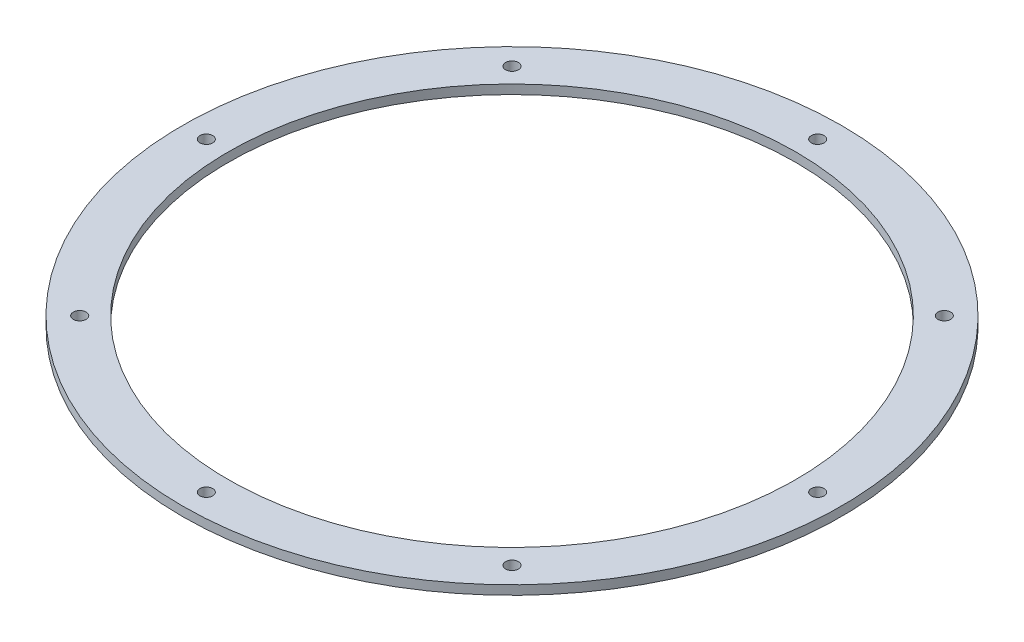
ISO-10303-21;
HEADER;
FILE_DESCRIPTION(('STEP AP214'),'2;1');
FILE_NAME('part.step','',(''),(''),'','','');
FILE_SCHEMA(('AUTOMOTIVE_DESIGN { 1 0 10303 214 1 1 1 1 }'));
ENDSEC;
DATA;
#1=APPLICATION_CONTEXT('core data for automotive mechanical design processes');
#2=APPLICATION_PROTOCOL_DEFINITION('international standard','automotive_design',2000,#1);
#3=PRODUCT_CONTEXT('',#1,'mechanical');
#4=PRODUCT('Part','Part','',(#3));
#5=PRODUCT_RELATED_PRODUCT_CATEGORY('part','',(#4));
#6=PRODUCT_DEFINITION_FORMATION('','',#4);
#7=PRODUCT_DEFINITION_CONTEXT('part definition',#1,'design');
#8=PRODUCT_DEFINITION('design','',#6,#7);
#9=PRODUCT_DEFINITION_SHAPE('','',#8);
#10=(LENGTH_UNIT() NAMED_UNIT(*) SI_UNIT(.MILLI.,.METRE.));
#11=(NAMED_UNIT(*) PLANE_ANGLE_UNIT() SI_UNIT($,.RADIAN.));
#12=(NAMED_UNIT(*) SI_UNIT($,.STERADIAN.) SOLID_ANGLE_UNIT());
#13=UNCERTAINTY_MEASURE_WITH_UNIT(LENGTH_MEASURE(1.E-05),#10,'distance_accuracy_value','');
#14=(GEOMETRIC_REPRESENTATION_CONTEXT(3) GLOBAL_UNCERTAINTY_ASSIGNED_CONTEXT((#13)) GLOBAL_UNIT_ASSIGNED_CONTEXT((#10,
#11,#12)) REPRESENTATION_CONTEXT('',''));
#15=CARTESIAN_POINT('',(0.,0.,0.));
#16=DIRECTION('',(0.,0.,1.));
#17=DIRECTION('',(1.,0.,0.));
#18=AXIS2_PLACEMENT_3D('',#15,#16,#17);
#19=CARTESIAN_POINT('',(0.,0.,0.));
#20=DIRECTION('',(0.,-1.,0.));
#21=DIRECTION('',(0.,0.,-1.));
#22=AXIS2_PLACEMENT_3D('',#19,#20,#21);
#23=CYLINDRICAL_SURFACE('',#22,93.08);
#24=CARTESIAN_POINT('',(0.,0.,0.));
#25=DIRECTION('',(0.,-1.,0.));
#26=DIRECTION('',(0.,0.,-1.));
#27=AXIS2_PLACEMENT_3D('',#24,#25,#26);
#28=CIRCLE('',#27,93.08);
#29=CARTESIAN_POINT('',(0.,0.,-93.08));
#30=VERTEX_POINT('',#29);
#31=EDGE_CURVE('E78',#30,#30,#28,.T.);
#32=ORIENTED_EDGE('',*,*,#31,.T.);
#33=EDGE_LOOP('',(#32));
#34=FACE_BOUND('',#33,.T.);
#35=CARTESIAN_POINT('',(0.,3.,0.));
#36=DIRECTION('',(0.,-1.,0.));
#37=DIRECTION('',(0.,0.,-1.));
#38=AXIS2_PLACEMENT_3D('',#35,#36,#37);
#39=CIRCLE('',#38,93.08);
#40=CARTESIAN_POINT('',(0.,3.,-93.08));
#41=VERTEX_POINT('',#40);
#42=EDGE_CURVE('E10',#41,#41,#39,.T.);
#43=ORIENTED_EDGE('',*,*,#42,.F.);
#44=EDGE_LOOP('',(#43));
#45=FACE_BOUND('',#44,.T.);
#46=ADVANCED_FACE('F39',(#34,#45),#23,.F.);
#47=CARTESIAN_POINT('',(93.08,3.,0.));
#48=DIRECTION('',(0.,1.,0.));
#49=DIRECTION('',(0.,0.,1.));
#50=AXIS2_PLACEMENT_3D('',#47,#48,#49);
#51=PLANE('',#50);
#52=CARTESIAN_POINT('',(-100.25,3.,0.));
#53=DIRECTION('',(0.,1.,0.));
#54=DIRECTION('',(0.,0.,1.));
#55=AXIS2_PLACEMENT_3D('',#52,#53,#54);
#56=CIRCLE('',#55,2.1);
#57=CARTESIAN_POINT('',(-100.25,3.,2.1));
#58=VERTEX_POINT('',#57);
#59=EDGE_CURVE('E59',#58,#58,#56,.T.);
#60=ORIENTED_EDGE('',*,*,#59,.F.);
#61=EDGE_LOOP('',(#60));
#62=FACE_BOUND('',#61,.T.);
#63=CARTESIAN_POINT('',(-70.8874548139514,3.,-70.8874548139514));
#64=DIRECTION('',(0.,1.,0.));
#65=DIRECTION('',(0.,0.,1.));
#66=AXIS2_PLACEMENT_3D('',#63,#64,#65);
#67=CIRCLE('',#66,2.1);
#68=CARTESIAN_POINT('',(-70.8874548139514,3.,-68.7874548139514));
#69=VERTEX_POINT('',#68);
#70=EDGE_CURVE('E105',#69,#69,#67,.T.);
#71=ORIENTED_EDGE('',*,*,#70,.F.);
#72=EDGE_LOOP('',(#71));
#73=FACE_BOUND('',#72,.T.);
#74=CARTESIAN_POINT('',(0.,3.,-100.25));
#75=DIRECTION('',(0.,1.,0.));
#76=DIRECTION('',(0.,0.,1.));
#77=AXIS2_PLACEMENT_3D('',#74,#75,#76);
#78=CIRCLE('',#77,2.1);
#79=CARTESIAN_POINT('',(0.,3.,-98.15));
#80=VERTEX_POINT('',#79);
#81=EDGE_CURVE('E102',#80,#80,#78,.T.);
#82=ORIENTED_EDGE('',*,*,#81,.F.);
#83=EDGE_LOOP('',(#82));
#84=FACE_BOUND('',#83,.T.);
#85=CARTESIAN_POINT('',(70.8874548139514,3.,-70.8874548139514));
#86=DIRECTION('',(0.,1.,0.));
#87=DIRECTION('',(0.,0.,1.));
#88=AXIS2_PLACEMENT_3D('',#85,#86,#87);
#89=CIRCLE('',#88,2.1);
#90=CARTESIAN_POINT('',(70.8874548139514,3.,-68.7874548139514));
#91=VERTEX_POINT('',#90);
#92=EDGE_CURVE('E99',#91,#91,#89,.T.);
#93=ORIENTED_EDGE('',*,*,#92,.F.);
#94=EDGE_LOOP('',(#93));
#95=FACE_BOUND('',#94,.T.);
#96=CARTESIAN_POINT('',(100.25,3.,0.));
#97=DIRECTION('',(0.,1.,0.));
#98=DIRECTION('',(0.,0.,1.));
#99=AXIS2_PLACEMENT_3D('',#96,#97,#98);
#100=CIRCLE('',#99,2.1);
#101=CARTESIAN_POINT('',(100.25,3.,2.09999999999999));
#102=VERTEX_POINT('',#101);
#103=EDGE_CURVE('E96',#102,#102,#100,.T.);
#104=ORIENTED_EDGE('',*,*,#103,.F.);
#105=EDGE_LOOP('',(#104));
#106=FACE_BOUND('',#105,.T.);
#107=CARTESIAN_POINT('',(70.8874548139514,3.,70.8874548139514));
#108=DIRECTION('',(0.,1.,0.));
#109=DIRECTION('',(0.,0.,1.));
#110=AXIS2_PLACEMENT_3D('',#107,#108,#109);
#111=CIRCLE('',#110,2.1);
#112=CARTESIAN_POINT('',(70.8874548139514,3.,72.9874548139514));
#113=VERTEX_POINT('',#112);
#114=EDGE_CURVE('E93',#113,#113,#111,.T.);
#115=ORIENTED_EDGE('',*,*,#114,.F.);
#116=EDGE_LOOP('',(#115));
#117=FACE_BOUND('',#116,.T.);
#118=CARTESIAN_POINT('',(0.,3.,100.25));
#119=DIRECTION('',(0.,1.,0.));
#120=DIRECTION('',(0.,0.,1.));
#121=AXIS2_PLACEMENT_3D('',#118,#119,#120);
#122=CIRCLE('',#121,2.1);
#123=CARTESIAN_POINT('',(0.,3.,102.35));
#124=VERTEX_POINT('',#123);
#125=EDGE_CURVE('E90',#124,#124,#122,.T.);
#126=ORIENTED_EDGE('',*,*,#125,.F.);
#127=EDGE_LOOP('',(#126));
#128=FACE_BOUND('',#127,.T.);
#129=CARTESIAN_POINT('',(-70.8874548139514,3.,70.8874548139514));
#130=DIRECTION('',(0.,1.,0.));
#131=DIRECTION('',(0.,0.,1.));
#132=AXIS2_PLACEMENT_3D('',#129,#130,#131);
#133=CIRCLE('',#132,2.1);
#134=CARTESIAN_POINT('',(-70.8874548139514,3.,72.9874548139514));
#135=VERTEX_POINT('',#134);
#136=EDGE_CURVE('E87',#135,#135,#133,.T.);
#137=ORIENTED_EDGE('',*,*,#136,.F.);
#138=EDGE_LOOP('',(#137));
#139=FACE_BOUND('',#138,.T.);
#140=ORIENTED_EDGE('',*,*,#42,.T.);
#141=EDGE_LOOP('',(#140));
#142=FACE_BOUND('',#141,.T.);
#143=CARTESIAN_POINT('',(0.,3.,0.));
#144=DIRECTION('',(0.,-1.,0.));
#145=DIRECTION('',(0.,0.,-1.));
#146=AXIS2_PLACEMENT_3D('',#143,#144,#145);
#147=CIRCLE('',#146,108.08);
#148=CARTESIAN_POINT('',(0.,3.,-108.08));
#149=VERTEX_POINT('',#148);
#150=EDGE_CURVE('E46',#149,#149,#147,.T.);
#151=ORIENTED_EDGE('',*,*,#150,.F.);
#152=EDGE_LOOP('',(#151));
#153=FACE_BOUND('',#152,.T.);
#154=ADVANCED_FACE('F113',(#62,#73,#84,#95,#106,#117,#128,#139,#142,#153),#51,.T.);
#155=CARTESIAN_POINT('',(0.,0.,0.));
#156=DIRECTION('',(0.,-1.,0.));
#157=DIRECTION('',(0.,0.,-1.));
#158=AXIS2_PLACEMENT_3D('',#155,#156,#157);
#159=CYLINDRICAL_SURFACE('',#158,108.08);
#160=ORIENTED_EDGE('',*,*,#150,.T.);
#161=EDGE_LOOP('',(#160));
#162=FACE_BOUND('',#161,.T.);
#163=CARTESIAN_POINT('',(0.,0.,0.));
#164=DIRECTION('',(0.,-1.,0.));
#165=DIRECTION('',(0.,0.,-1.));
#166=AXIS2_PLACEMENT_3D('',#163,#164,#165);
#167=CIRCLE('',#166,108.08);
#168=CARTESIAN_POINT('',(0.,0.,-108.08));
#169=VERTEX_POINT('',#168);
#170=EDGE_CURVE('E51',#169,#169,#167,.T.);
#171=ORIENTED_EDGE('',*,*,#170,.F.);
#172=EDGE_LOOP('',(#171));
#173=FACE_BOUND('',#172,.T.);
#174=ADVANCED_FACE('F116',(#162,#173),#159,.T.);
#175=CARTESIAN_POINT('',(93.08,0.,0.));
#176=DIRECTION('',(0.,-1.,0.));
#177=DIRECTION('',(0.,0.,-1.));
#178=AXIS2_PLACEMENT_3D('',#175,#176,#177);
#179=PLANE('',#178);
#180=CARTESIAN_POINT('',(-100.25,0.,0.));
#181=DIRECTION('',(0.,-1.,0.));
#182=DIRECTION('',(0.,0.,-1.));
#183=AXIS2_PLACEMENT_3D('',#180,#181,#182);
#184=CIRCLE('',#183,2.1);
#185=CARTESIAN_POINT('',(-100.25,0.,-2.1));
#186=VERTEX_POINT('',#185);
#187=EDGE_CURVE('E42',#186,#186,#184,.T.);
#188=ORIENTED_EDGE('',*,*,#187,.F.);
#189=EDGE_LOOP('',(#188));
#190=FACE_BOUND('',#189,.T.);
#191=CARTESIAN_POINT('',(-70.8874548139514,0.,-70.8874548139514));
#192=DIRECTION('',(0.,-1.,0.));
#193=DIRECTION('',(0.,0.,-1.));
#194=AXIS2_PLACEMENT_3D('',#191,#192,#193);
#195=CIRCLE('',#194,2.1);
#196=CARTESIAN_POINT('',(-70.8874548139514,0.,-72.9874548139514));
#197=VERTEX_POINT('',#196);
#198=EDGE_CURVE('E73',#197,#197,#195,.T.);
#199=ORIENTED_EDGE('',*,*,#198,.F.);
#200=EDGE_LOOP('',(#199));
#201=FACE_BOUND('',#200,.T.);
#202=CARTESIAN_POINT('',(0.,0.,-100.25));
#203=DIRECTION('',(0.,-1.,0.));
#204=DIRECTION('',(0.,0.,-1.));
#205=AXIS2_PLACEMENT_3D('',#202,#203,#204);
#206=CIRCLE('',#205,2.1);
#207=CARTESIAN_POINT('',(0.,0.,-102.35));
#208=VERTEX_POINT('',#207);
#209=EDGE_CURVE('E71',#208,#208,#206,.T.);
#210=ORIENTED_EDGE('',*,*,#209,.F.);
#211=EDGE_LOOP('',(#210));
#212=FACE_BOUND('',#211,.T.);
#213=CARTESIAN_POINT('',(70.8874548139514,0.,-70.8874548139514));
#214=DIRECTION('',(0.,-1.,0.));
#215=DIRECTION('',(0.,0.,-1.));
#216=AXIS2_PLACEMENT_3D('',#213,#214,#215);
#217=CIRCLE('',#216,2.1);
#218=CARTESIAN_POINT('',(70.8874548139514,0.,-72.9874548139514));
#219=VERTEX_POINT('',#218);
#220=EDGE_CURVE('E68',#219,#219,#217,.T.);
#221=ORIENTED_EDGE('',*,*,#220,.F.);
#222=EDGE_LOOP('',(#221));
#223=FACE_BOUND('',#222,.T.);
#224=CARTESIAN_POINT('',(100.25,0.,0.));
#225=DIRECTION('',(0.,-1.,0.));
#226=DIRECTION('',(0.,0.,-1.));
#227=AXIS2_PLACEMENT_3D('',#224,#225,#226);
#228=CIRCLE('',#227,2.1);
#229=CARTESIAN_POINT('',(100.25,0.,-2.10000000000002));
#230=VERTEX_POINT('',#229);
#231=EDGE_CURVE('E65',#230,#230,#228,.T.);
#232=ORIENTED_EDGE('',*,*,#231,.F.);
#233=EDGE_LOOP('',(#232));
#234=FACE_BOUND('',#233,.T.);
#235=CARTESIAN_POINT('',(70.8874548139514,0.,70.8874548139514));
#236=DIRECTION('',(0.,-1.,0.));
#237=DIRECTION('',(0.,0.,-1.));
#238=AXIS2_PLACEMENT_3D('',#235,#236,#237);
#239=CIRCLE('',#238,2.1);
#240=CARTESIAN_POINT('',(70.8874548139514,0.,68.7874548139514));
#241=VERTEX_POINT('',#240);
#242=EDGE_CURVE('E62',#241,#241,#239,.T.);
#243=ORIENTED_EDGE('',*,*,#242,.F.);
#244=EDGE_LOOP('',(#243));
#245=FACE_BOUND('',#244,.T.);
#246=CARTESIAN_POINT('',(0.,0.,100.25));
#247=DIRECTION('',(0.,-1.,0.));
#248=DIRECTION('',(0.,0.,-1.));
#249=AXIS2_PLACEMENT_3D('',#246,#247,#248);
#250=CIRCLE('',#249,2.1);
#251=CARTESIAN_POINT('',(0.,0.,98.15));
#252=VERTEX_POINT('',#251);
#253=EDGE_CURVE('E58',#252,#252,#250,.T.);
#254=ORIENTED_EDGE('',*,*,#253,.F.);
#255=EDGE_LOOP('',(#254));
#256=FACE_BOUND('',#255,.T.);
#257=CARTESIAN_POINT('',(-70.8874548139514,0.,70.8874548139514));
#258=DIRECTION('',(0.,-1.,0.));
#259=DIRECTION('',(0.,0.,-1.));
#260=AXIS2_PLACEMENT_3D('',#257,#258,#259);
#261=CIRCLE('',#260,2.1);
#262=CARTESIAN_POINT('',(-70.8874548139514,0.,68.7874548139514));
#263=VERTEX_POINT('',#262);
#264=EDGE_CURVE('E55',#263,#263,#261,.T.);
#265=ORIENTED_EDGE('',*,*,#264,.F.);
#266=EDGE_LOOP('',(#265));
#267=FACE_BOUND('',#266,.T.);
#268=ORIENTED_EDGE('',*,*,#170,.T.);
#269=EDGE_LOOP('',(#268));
#270=FACE_BOUND('',#269,.T.);
#271=ORIENTED_EDGE('',*,*,#31,.F.);
#272=EDGE_LOOP('',(#271));
#273=FACE_BOUND('',#272,.T.);
#274=ADVANCED_FACE('F135',(#190,#201,#212,#223,#234,#245,#256,#267,#270,#273),#179,.T.);
#275=CARTESIAN_POINT('',(-70.8874548139514,-7.,70.8874548139514));
#276=DIRECTION('',(0.,1.,0.));
#277=DIRECTION('',(0.,0.,1.));
#278=AXIS2_PLACEMENT_3D('',#275,#276,#277);
#279=CYLINDRICAL_SURFACE('',#278,2.1);
#280=ORIENTED_EDGE('',*,*,#264,.T.);
#281=EDGE_LOOP('',(#280));
#282=FACE_BOUND('',#281,.T.);
#283=ORIENTED_EDGE('',*,*,#136,.T.);
#284=EDGE_LOOP('',(#283));
#285=FACE_BOUND('',#284,.T.);
#286=ADVANCED_FACE('F141',(#282,#285),#279,.F.);
#287=CARTESIAN_POINT('',(0.,-7.,100.25));
#288=DIRECTION('',(0.,1.,0.));
#289=DIRECTION('',(0.,0.,1.));
#290=AXIS2_PLACEMENT_3D('',#287,#288,#289);
#291=CYLINDRICAL_SURFACE('',#290,2.1);
#292=ORIENTED_EDGE('',*,*,#253,.T.);
#293=EDGE_LOOP('',(#292));
#294=FACE_BOUND('',#293,.T.);
#295=ORIENTED_EDGE('',*,*,#125,.T.);
#296=EDGE_LOOP('',(#295));
#297=FACE_BOUND('',#296,.T.);
#298=ADVANCED_FACE('F147',(#294,#297),#291,.F.);
#299=CARTESIAN_POINT('',(70.8874548139514,-7.,70.8874548139514));
#300=DIRECTION('',(0.,1.,0.));
#301=DIRECTION('',(0.,0.,1.));
#302=AXIS2_PLACEMENT_3D('',#299,#300,#301);
#303=CYLINDRICAL_SURFACE('',#302,2.1);
#304=ORIENTED_EDGE('',*,*,#242,.T.);
#305=EDGE_LOOP('',(#304));
#306=FACE_BOUND('',#305,.T.);
#307=ORIENTED_EDGE('',*,*,#114,.T.);
#308=EDGE_LOOP('',(#307));
#309=FACE_BOUND('',#308,.T.);
#310=ADVANCED_FACE('F185',(#306,#309),#303,.F.);
#311=CARTESIAN_POINT('',(100.25,-7.,0.));
#312=DIRECTION('',(0.,1.,0.));
#313=DIRECTION('',(0.,0.,1.));
#314=AXIS2_PLACEMENT_3D('',#311,#312,#313);
#315=CYLINDRICAL_SURFACE('',#314,2.1);
#316=ORIENTED_EDGE('',*,*,#231,.T.);
#317=EDGE_LOOP('',(#316));
#318=FACE_BOUND('',#317,.T.);
#319=ORIENTED_EDGE('',*,*,#103,.T.);
#320=EDGE_LOOP('',(#319));
#321=FACE_BOUND('',#320,.T.);
#322=ADVANCED_FACE('F194',(#318,#321),#315,.F.);
#323=CARTESIAN_POINT('',(70.8874548139514,-7.,-70.8874548139514));
#324=DIRECTION('',(0.,1.,0.));
#325=DIRECTION('',(0.,0.,1.));
#326=AXIS2_PLACEMENT_3D('',#323,#324,#325);
#327=CYLINDRICAL_SURFACE('',#326,2.1);
#328=ORIENTED_EDGE('',*,*,#220,.T.);
#329=EDGE_LOOP('',(#328));
#330=FACE_BOUND('',#329,.T.);
#331=ORIENTED_EDGE('',*,*,#92,.T.);
#332=EDGE_LOOP('',(#331));
#333=FACE_BOUND('',#332,.T.);
#334=ADVANCED_FACE('F203',(#330,#333),#327,.F.);
#335=CARTESIAN_POINT('',(0.,-7.,-100.25));
#336=DIRECTION('',(0.,1.,0.));
#337=DIRECTION('',(0.,0.,1.));
#338=AXIS2_PLACEMENT_3D('',#335,#336,#337);
#339=CYLINDRICAL_SURFACE('',#338,2.1);
#340=ORIENTED_EDGE('',*,*,#209,.T.);
#341=EDGE_LOOP('',(#340));
#342=FACE_BOUND('',#341,.T.);
#343=ORIENTED_EDGE('',*,*,#81,.T.);
#344=EDGE_LOOP('',(#343));
#345=FACE_BOUND('',#344,.T.);
#346=ADVANCED_FACE('F212',(#342,#345),#339,.F.);
#347=CARTESIAN_POINT('',(-70.8874548139514,-7.,-70.8874548139514));
#348=DIRECTION('',(0.,1.,0.));
#349=DIRECTION('',(0.,0.,1.));
#350=AXIS2_PLACEMENT_3D('',#347,#348,#349);
#351=CYLINDRICAL_SURFACE('',#350,2.1);
#352=ORIENTED_EDGE('',*,*,#198,.T.);
#353=EDGE_LOOP('',(#352));
#354=FACE_BOUND('',#353,.T.);
#355=ORIENTED_EDGE('',*,*,#70,.T.);
#356=EDGE_LOOP('',(#355));
#357=FACE_BOUND('',#356,.T.);
#358=ADVANCED_FACE('F221',(#354,#357),#351,.F.);
#359=CARTESIAN_POINT('',(-100.25,-7.,0.));
#360=DIRECTION('',(0.,1.,0.));
#361=DIRECTION('',(0.,0.,1.));
#362=AXIS2_PLACEMENT_3D('',#359,#360,#361);
#363=CYLINDRICAL_SURFACE('',#362,2.1);
#364=ORIENTED_EDGE('',*,*,#187,.T.);
#365=EDGE_LOOP('',(#364));
#366=FACE_BOUND('',#365,.T.);
#367=ORIENTED_EDGE('',*,*,#59,.T.);
#368=EDGE_LOOP('',(#367));
#369=FACE_BOUND('',#368,.T.);
#370=ADVANCED_FACE('F111',(#366,#369),#363,.F.);
#371=CLOSED_SHELL('',(#46,#154,#174,#274,#286,#298,#310,#322,#334,#346,#358,#370));
#372=MANIFOLD_SOLID_BREP('B2',#371);
#373=ADVANCED_BREP_SHAPE_REPRESENTATION('',(#18,#372),#14);
#374=SHAPE_DEFINITION_REPRESENTATION(#9,#373);
ENDSEC;
END-ISO-10303-21;
